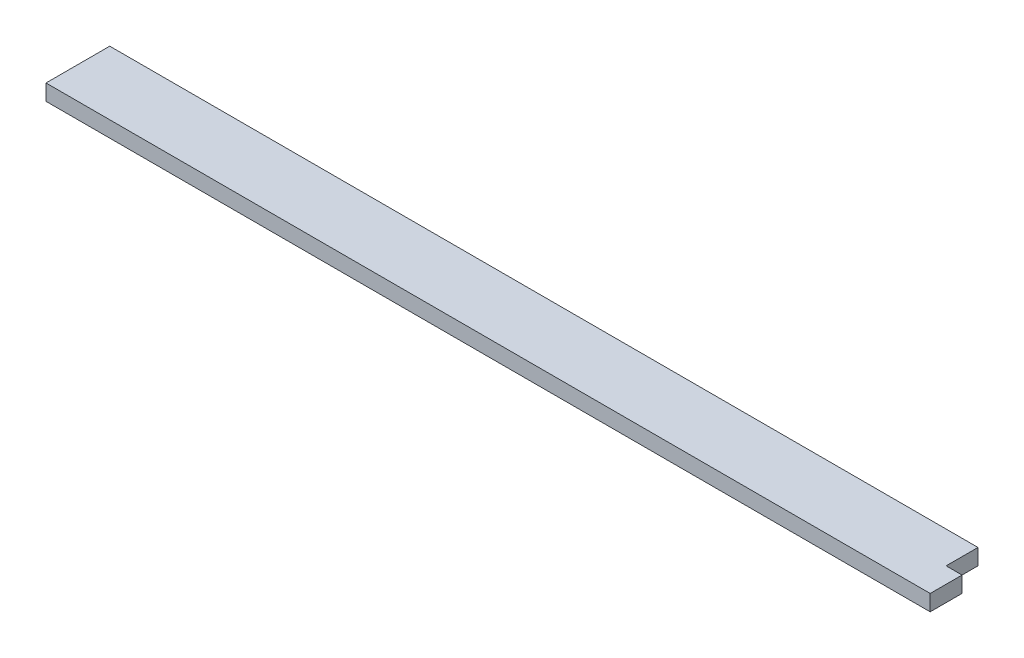
ISO-10303-21;
HEADER;
FILE_DESCRIPTION(('STEP AP214'),'2;1');
FILE_NAME('part.step','',(''),(''),'','','');
FILE_SCHEMA(('AUTOMOTIVE_DESIGN { 1 0 10303 214 1 1 1 1 }'));
ENDSEC;
DATA;
#1=APPLICATION_CONTEXT('core data for automotive mechanical design processes');
#2=APPLICATION_PROTOCOL_DEFINITION('international standard','automotive_design',2000,#1);
#3=PRODUCT_CONTEXT('',#1,'mechanical');
#4=PRODUCT('Part','Part','',(#3));
#5=PRODUCT_RELATED_PRODUCT_CATEGORY('part','',(#4));
#6=PRODUCT_DEFINITION_FORMATION('','',#4);
#7=PRODUCT_DEFINITION_CONTEXT('part definition',#1,'design');
#8=PRODUCT_DEFINITION('design','',#6,#7);
#9=PRODUCT_DEFINITION_SHAPE('','',#8);
#10=(LENGTH_UNIT() NAMED_UNIT(*) SI_UNIT(.MILLI.,.METRE.));
#11=(NAMED_UNIT(*) PLANE_ANGLE_UNIT() SI_UNIT($,.RADIAN.));
#12=(NAMED_UNIT(*) SI_UNIT($,.STERADIAN.) SOLID_ANGLE_UNIT());
#13=UNCERTAINTY_MEASURE_WITH_UNIT(LENGTH_MEASURE(1.E-05),#10,'distance_accuracy_value','');
#14=(GEOMETRIC_REPRESENTATION_CONTEXT(3) GLOBAL_UNCERTAINTY_ASSIGNED_CONTEXT((#13)) GLOBAL_UNIT_ASSIGNED_CONTEXT((#10,
#11,#12)) REPRESENTATION_CONTEXT('',''));
#15=CARTESIAN_POINT('',(0.,0.,0.));
#16=DIRECTION('',(0.,0.,1.));
#17=DIRECTION('',(1.,0.,0.));
#18=AXIS2_PLACEMENT_3D('',#15,#16,#17);
#19=CARTESIAN_POINT('',(-88.0745,3.175,-6.35));
#20=DIRECTION('',(1.,0.,0.));
#21=DIRECTION('',(0.,0.,-1.));
#22=AXIS2_PLACEMENT_3D('',#19,#20,#21);
#23=PLANE('',#22);
#24=DIRECTION('',(0.,0.,1.));
#25=VECTOR('',#24,1.);
#26=CARTESIAN_POINT('',(-88.0745,0.,-6.35));
#27=LINE('',#26,#25);
#28=CARTESIAN_POINT('',(-88.0745,0.,-6.35));
#29=VERTEX_POINT('',#28);
#30=CARTESIAN_POINT('',(-88.0745,0.,6.35));
#31=VERTEX_POINT('',#30);
#32=EDGE_CURVE('E117',#29,#31,#27,.T.);
#33=ORIENTED_EDGE('',*,*,#32,.T.);
#34=DIRECTION('',(0.,-1.,0.));
#35=VECTOR('',#34,1.);
#36=CARTESIAN_POINT('',(-88.0745,3.175,6.35));
#37=LINE('',#36,#35);
#38=CARTESIAN_POINT('',(-88.0745,3.175,6.35));
#39=VERTEX_POINT('',#38);
#40=EDGE_CURVE('E11',#39,#31,#37,.T.);
#41=ORIENTED_EDGE('',*,*,#40,.F.);
#42=DIRECTION('',(0.,0.,1.));
#43=VECTOR('',#42,1.);
#44=CARTESIAN_POINT('',(-88.0745,3.175,-6.35));
#45=LINE('',#44,#43);
#46=CARTESIAN_POINT('',(-88.0745,3.175,-6.35));
#47=VERTEX_POINT('',#46);
#48=EDGE_CURVE('E127',#47,#39,#45,.T.);
#49=ORIENTED_EDGE('',*,*,#48,.F.);
#50=DIRECTION('',(0.,-1.,0.));
#51=VECTOR('',#50,1.);
#52=CARTESIAN_POINT('',(-88.0745,3.175,-6.35));
#53=LINE('',#52,#51);
#54=EDGE_CURVE('E113',#47,#29,#53,.T.);
#55=ORIENTED_EDGE('',*,*,#54,.T.);
#56=EDGE_LOOP('',(#33,#41,#49,#55));
#57=FACE_BOUND('',#56,.T.);
#58=ADVANCED_FACE('F33',(#57),#23,.F.);
#59=CARTESIAN_POINT('',(-88.0745,3.175,6.35));
#60=DIRECTION('',(0.,0.,-1.));
#61=DIRECTION('',(-1.,0.,0.));
#62=AXIS2_PLACEMENT_3D('',#59,#60,#61);
#63=PLANE('',#62);
#64=DIRECTION('',(1.,0.,0.));
#65=VECTOR('',#64,1.);
#66=CARTESIAN_POINT('',(-88.0745,0.,6.35));
#67=LINE('',#66,#65);
#68=CARTESIAN_POINT('',(88.0745,0.,6.34999999999999));
#69=VERTEX_POINT('',#68);
#70=EDGE_CURVE('E120',#31,#69,#67,.T.);
#71=ORIENTED_EDGE('',*,*,#70,.T.);
#72=DIRECTION('',(0.,-1.,0.));
#73=VECTOR('',#72,1.);
#74=CARTESIAN_POINT('',(88.0745,3.175,6.34999999999999));
#75=LINE('',#74,#73);
#76=CARTESIAN_POINT('',(88.0745,3.175,6.34999999999999));
#77=VERTEX_POINT('',#76);
#78=EDGE_CURVE('E41',#77,#69,#75,.T.);
#79=ORIENTED_EDGE('',*,*,#78,.F.);
#80=DIRECTION('',(1.,0.,0.));
#81=VECTOR('',#80,1.);
#82=CARTESIAN_POINT('',(-88.0745,3.175,6.35));
#83=LINE('',#82,#81);
#84=EDGE_CURVE('E86',#39,#77,#83,.T.);
#85=ORIENTED_EDGE('',*,*,#84,.F.);
#86=ORIENTED_EDGE('',*,*,#40,.T.);
#87=EDGE_LOOP('',(#71,#79,#85,#86));
#88=FACE_BOUND('',#87,.T.);
#89=ADVANCED_FACE('F151',(#88),#63,.F.);
#90=CARTESIAN_POINT('',(88.0745,3.175,0.));
#91=DIRECTION('',(-1.,0.,0.));
#92=DIRECTION('',(0.,0.,1.));
#93=AXIS2_PLACEMENT_3D('',#90,#91,#92);
#94=PLANE('',#93);
#95=DIRECTION('',(0.,0.,-1.));
#96=VECTOR('',#95,1.);
#97=CARTESIAN_POINT('',(88.0745,0.,0.));
#98=LINE('',#97,#96);
#99=CARTESIAN_POINT('',(88.0745,0.,0.));
#100=VERTEX_POINT('',#99);
#101=EDGE_CURVE('E122',#69,#100,#98,.T.);
#102=ORIENTED_EDGE('',*,*,#101,.T.);
#103=DIRECTION('',(0.,-1.,0.));
#104=VECTOR('',#103,1.);
#105=CARTESIAN_POINT('',(88.0745,3.175,0.));
#106=LINE('',#105,#104);
#107=CARTESIAN_POINT('',(88.0745,3.175,0.));
#108=VERTEX_POINT('',#107);
#109=EDGE_CURVE('E108',#108,#100,#106,.T.);
#110=ORIENTED_EDGE('',*,*,#109,.F.);
#111=DIRECTION('',(0.,0.,-1.));
#112=VECTOR('',#111,1.);
#113=CARTESIAN_POINT('',(88.0745,3.175,0.));
#114=LINE('',#113,#112);
#115=EDGE_CURVE('E99',#77,#108,#114,.T.);
#116=ORIENTED_EDGE('',*,*,#115,.F.);
#117=ORIENTED_EDGE('',*,*,#78,.T.);
#118=EDGE_LOOP('',(#102,#110,#116,#117));
#119=FACE_BOUND('',#118,.T.);
#120=ADVANCED_FACE('F133',(#119),#94,.F.);
#121=CARTESIAN_POINT('',(84.8995,3.175,0.));
#122=DIRECTION('',(0.,0.,1.));
#123=DIRECTION('',(1.,0.,0.));
#124=AXIS2_PLACEMENT_3D('',#121,#122,#123);
#125=PLANE('',#124);
#126=DIRECTION('',(-1.,0.,0.));
#127=VECTOR('',#126,1.);
#128=CARTESIAN_POINT('',(84.8995,0.,0.));
#129=LINE('',#128,#127);
#130=CARTESIAN_POINT('',(84.8995,0.,0.));
#131=VERTEX_POINT('',#130);
#132=EDGE_CURVE('E107',#100,#131,#129,.T.);
#133=ORIENTED_EDGE('',*,*,#132,.T.);
#134=DIRECTION('',(0.,-1.,0.));
#135=VECTOR('',#134,1.);
#136=CARTESIAN_POINT('',(84.8995,3.175,0.));
#137=LINE('',#136,#135);
#138=CARTESIAN_POINT('',(84.8995,3.175,0.));
#139=VERTEX_POINT('',#138);
#140=EDGE_CURVE('E104',#139,#131,#137,.T.);
#141=ORIENTED_EDGE('',*,*,#140,.F.);
#142=DIRECTION('',(-1.,0.,0.));
#143=VECTOR('',#142,1.);
#144=CARTESIAN_POINT('',(84.8995,3.175,0.));
#145=LINE('',#144,#143);
#146=EDGE_CURVE('E93',#108,#139,#145,.T.);
#147=ORIENTED_EDGE('',*,*,#146,.F.);
#148=ORIENTED_EDGE('',*,*,#109,.T.);
#149=EDGE_LOOP('',(#133,#141,#147,#148));
#150=FACE_BOUND('',#149,.T.);
#151=ADVANCED_FACE('F105',(#150),#125,.F.);
#152=CARTESIAN_POINT('',(84.8995,3.175,-6.34999999999999));
#153=DIRECTION('',(-1.,0.,0.));
#154=DIRECTION('',(0.,0.,1.));
#155=AXIS2_PLACEMENT_3D('',#152,#153,#154);
#156=PLANE('',#155);
#157=DIRECTION('',(0.,0.,-1.));
#158=VECTOR('',#157,1.);
#159=CARTESIAN_POINT('',(84.8995,0.,-6.34999999999999));
#160=LINE('',#159,#158);
#161=CARTESIAN_POINT('',(84.8995,0.,-6.34999999999999));
#162=VERTEX_POINT('',#161);
#163=EDGE_CURVE('E72',#131,#162,#160,.T.);
#164=ORIENTED_EDGE('',*,*,#163,.T.);
#165=DIRECTION('',(0.,-1.,0.));
#166=VECTOR('',#165,1.);
#167=CARTESIAN_POINT('',(84.8995,3.175,-6.34999999999999));
#168=LINE('',#167,#166);
#169=CARTESIAN_POINT('',(84.8995,3.175,-6.34999999999999));
#170=VERTEX_POINT('',#169);
#171=EDGE_CURVE('E109',#170,#162,#168,.T.);
#172=ORIENTED_EDGE('',*,*,#171,.F.);
#173=DIRECTION('',(0.,0.,-1.));
#174=VECTOR('',#173,1.);
#175=CARTESIAN_POINT('',(84.8995,3.175,-6.34999999999999));
#176=LINE('',#175,#174);
#177=EDGE_CURVE('E97',#139,#170,#176,.T.);
#178=ORIENTED_EDGE('',*,*,#177,.F.);
#179=ORIENTED_EDGE('',*,*,#140,.T.);
#180=EDGE_LOOP('',(#164,#172,#178,#179));
#181=FACE_BOUND('',#180,.T.);
#182=ADVANCED_FACE('F111',(#181),#156,.F.);
#183=CARTESIAN_POINT('',(-88.0745,3.175,-6.35));
#184=DIRECTION('',(0.,0.,1.));
#185=DIRECTION('',(1.,0.,0.));
#186=AXIS2_PLACEMENT_3D('',#183,#184,#185);
#187=PLANE('',#186);
#188=DIRECTION('',(-1.,0.,0.));
#189=VECTOR('',#188,1.);
#190=CARTESIAN_POINT('',(-88.0745,0.,-6.35));
#191=LINE('',#190,#189);
#192=EDGE_CURVE('E78',#162,#29,#191,.T.);
#193=ORIENTED_EDGE('',*,*,#192,.T.);
#194=ORIENTED_EDGE('',*,*,#54,.F.);
#195=DIRECTION('',(-1.,0.,0.));
#196=VECTOR('',#195,1.);
#197=CARTESIAN_POINT('',(-88.0745,3.175,-6.35));
#198=LINE('',#197,#196);
#199=EDGE_CURVE('E49',#170,#47,#198,.T.);
#200=ORIENTED_EDGE('',*,*,#199,.F.);
#201=ORIENTED_EDGE('',*,*,#171,.T.);
#202=EDGE_LOOP('',(#193,#194,#200,#201));
#203=FACE_BOUND('',#202,.T.);
#204=ADVANCED_FACE('F140',(#203),#187,.F.);
#205=CARTESIAN_POINT('',(0.,3.175,0.));
#206=DIRECTION('',(0.,1.,0.));
#207=DIRECTION('',(0.,0.,1.));
#208=AXIS2_PLACEMENT_3D('',#205,#206,#207);
#209=PLANE('',#208);
#210=ORIENTED_EDGE('',*,*,#48,.T.);
#211=ORIENTED_EDGE('',*,*,#84,.T.);
#212=ORIENTED_EDGE('',*,*,#115,.T.);
#213=ORIENTED_EDGE('',*,*,#146,.T.);
#214=ORIENTED_EDGE('',*,*,#177,.T.);
#215=ORIENTED_EDGE('',*,*,#199,.T.);
#216=EDGE_LOOP('',(#210,#211,#212,#213,#214,#215));
#217=FACE_BOUND('',#216,.T.);
#218=ADVANCED_FACE('F95',(#217),#209,.T.);
#219=CARTESIAN_POINT('',(0.,0.,0.));
#220=DIRECTION('',(0.,1.,0.));
#221=DIRECTION('',(0.,0.,1.));
#222=AXIS2_PLACEMENT_3D('',#219,#220,#221);
#223=PLANE('',#222);
#224=ORIENTED_EDGE('',*,*,#32,.F.);
#225=ORIENTED_EDGE('',*,*,#192,.F.);
#226=ORIENTED_EDGE('',*,*,#163,.F.);
#227=ORIENTED_EDGE('',*,*,#132,.F.);
#228=ORIENTED_EDGE('',*,*,#101,.F.);
#229=ORIENTED_EDGE('',*,*,#70,.F.);
#230=EDGE_LOOP('',(#224,#225,#226,#227,#228,#229));
#231=FACE_BOUND('',#230,.T.);
#232=ADVANCED_FACE('F136',(#231),#223,.F.);
#233=CLOSED_SHELL('',(#58,#89,#120,#151,#182,#204,#218,#232));
#234=MANIFOLD_SOLID_BREP('B2',#233);
#235=ADVANCED_BREP_SHAPE_REPRESENTATION('',(#18,#234),#14);
#236=SHAPE_DEFINITION_REPRESENTATION(#9,#235);
ENDSEC;
END-ISO-10303-21;
